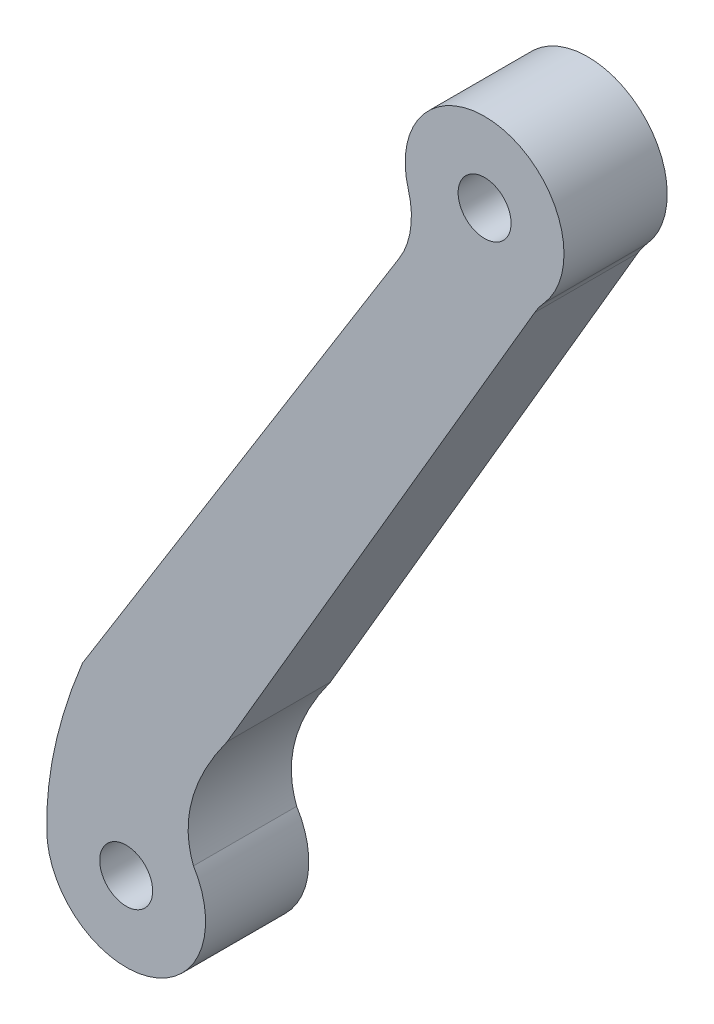
ISO-10303-21;
HEADER;
FILE_DESCRIPTION(('STEP AP214'),'2;1');
FILE_NAME('part.step','',(''),(''),'','','');
FILE_SCHEMA(('AUTOMOTIVE_DESIGN { 1 0 10303 214 1 1 1 1 }'));
ENDSEC;
DATA;
#1=APPLICATION_CONTEXT('core data for automotive mechanical design processes');
#2=APPLICATION_PROTOCOL_DEFINITION('international standard','automotive_design',2000,#1);
#3=PRODUCT_CONTEXT('',#1,'mechanical');
#4=PRODUCT('Part','Part','',(#3));
#5=PRODUCT_RELATED_PRODUCT_CATEGORY('part','',(#4));
#6=PRODUCT_DEFINITION_FORMATION('','',#4);
#7=PRODUCT_DEFINITION_CONTEXT('part definition',#1,'design');
#8=PRODUCT_DEFINITION('design','',#6,#7);
#9=PRODUCT_DEFINITION_SHAPE('','',#8);
#10=(LENGTH_UNIT() NAMED_UNIT(*) SI_UNIT(.MILLI.,.METRE.));
#11=(NAMED_UNIT(*) PLANE_ANGLE_UNIT() SI_UNIT($,.RADIAN.));
#12=(NAMED_UNIT(*) SI_UNIT($,.STERADIAN.) SOLID_ANGLE_UNIT());
#13=UNCERTAINTY_MEASURE_WITH_UNIT(LENGTH_MEASURE(1.E-05),#10,'distance_accuracy_value','');
#14=(GEOMETRIC_REPRESENTATION_CONTEXT(3) GLOBAL_UNCERTAINTY_ASSIGNED_CONTEXT((#13)) GLOBAL_UNIT_ASSIGNED_CONTEXT((#10,
#11,#12)) REPRESENTATION_CONTEXT('',''));
#15=CARTESIAN_POINT('',(0.,0.,0.));
#16=DIRECTION('',(0.,0.,1.));
#17=DIRECTION('',(1.,0.,0.));
#18=AXIS2_PLACEMENT_3D('',#15,#16,#17);
#19=CARTESIAN_POINT('',(18.0164608532114,94.1948252806854,3.9));
#20=CARTESIAN_POINT('',(15.9886170182341,91.4157600232767,3.9));
#21=CARTESIAN_POINT('',(16.7389516223177,89.4869260874124,3.9));
#22=B_SPLINE_CURVE_WITH_KNOTS('',2,(#19,#20,#21),.UNSPECIFIED.,.F.,.F.,(3,3),(0.,1.),.UNSPECIFIED.);
#23=DIRECTION('',(0.,0.,-1.));
#24=VECTOR('',#23,1.);
#25=SURFACE_OF_LINEAR_EXTRUSION('',#22,#24);
#26=CARTESIAN_POINT('',(18.0164608532114,94.1948252806854,0.));
#27=CARTESIAN_POINT('',(15.9886170182341,91.4157600232767,0.));
#28=CARTESIAN_POINT('',(16.7389516223177,89.4869260874124,0.));
#29=B_SPLINE_CURVE_WITH_KNOTS('',2,(#26,#27,#28),.UNSPECIFIED.,.F.,.F.,(3,3),(0.,1.),.UNSPECIFIED.);
#30=CARTESIAN_POINT('',(18.0164608532114,94.1948252806854,0.));
#31=VERTEX_POINT('',#30);
#32=CARTESIAN_POINT('',(16.7389516223177,89.4869260874124,0.));
#33=VERTEX_POINT('',#32);
#34=EDGE_CURVE('E172',#31,#33,#29,.T.);
#35=ORIENTED_EDGE('',*,*,#34,.F.);
#36=DIRECTION('',(0.,0.,-1.));
#37=VECTOR('',#36,1.);
#38=CARTESIAN_POINT('',(18.0164608532114,94.1948252806854,3.9));
#39=LINE('',#38,#37);
#40=CARTESIAN_POINT('',(18.0164608532114,94.1948252806854,3.9));
#41=VERTEX_POINT('',#40);
#42=EDGE_CURVE('E11',#41,#31,#39,.T.);
#43=ORIENTED_EDGE('',*,*,#42,.F.);
#44=CARTESIAN_POINT('',(16.7389516223177,89.4869260874124,3.9));
#45=VERTEX_POINT('',#44);
#46=EDGE_CURVE('E202',#41,#45,#22,.T.);
#47=ORIENTED_EDGE('',*,*,#46,.T.);
#48=DIRECTION('',(0.,0.,-1.));
#49=VECTOR('',#48,1.);
#50=CARTESIAN_POINT('',(16.7389516223177,89.4869260874124,3.9));
#51=LINE('',#50,#49);
#52=EDGE_CURVE('E87',#45,#33,#51,.T.);
#53=ORIENTED_EDGE('',*,*,#52,.T.);
#54=EDGE_LOOP('',(#35,#43,#47,#53));
#55=FACE_BOUND('',#54,.T.);
#56=ADVANCED_FACE('F36',(#55),#25,.T.);
#57=CARTESIAN_POINT('',(-27.64151576103,16.1763745397966,3.9));
#58=DIRECTION('',(0.863069254822421,-0.505085598072515,0.));
#59=DIRECTION('',(0.505085598072515,0.863069254822421,0.));
#60=AXIS2_PLACEMENT_3D('',#57,#58,#59);
#61=PLANE('',#60);
#62=DIRECTION('',(-0.505085598072515,-0.863069254822422,0.));
#63=VECTOR('',#62,1.);
#64=CARTESIAN_POINT('',(-27.64151576103,16.1763745397966,0.));
#65=LINE('',#64,#63);
#66=CARTESIAN_POINT('',(29.6287438279882,114.037411274176,0.));
#67=VERTEX_POINT('',#66);
#68=EDGE_CURVE('E165',#67,#31,#65,.T.);
#69=ORIENTED_EDGE('',*,*,#68,.F.);
#70=DIRECTION('',(0.,0.,-1.));
#71=VECTOR('',#70,1.);
#72=CARTESIAN_POINT('',(29.6287438279882,114.037411274176,3.9));
#73=LINE('',#72,#71);
#74=CARTESIAN_POINT('',(29.6287438279882,114.037411274176,3.9));
#75=VERTEX_POINT('',#74);
#76=EDGE_CURVE('E45',#75,#67,#73,.T.);
#77=ORIENTED_EDGE('',*,*,#76,.F.);
#78=DIRECTION('',(-0.505085598072515,-0.863069254822422,0.));
#79=VECTOR('',#78,1.);
#80=CARTESIAN_POINT('',(-27.64151576103,16.1763745397966,3.9));
#81=LINE('',#80,#79);
#82=EDGE_CURVE('E214',#75,#41,#81,.T.);
#83=ORIENTED_EDGE('',*,*,#82,.T.);
#84=ORIENTED_EDGE('',*,*,#42,.T.);
#85=EDGE_LOOP('',(#69,#77,#83,#84));
#86=FACE_BOUND('',#85,.T.);
#87=ADVANCED_FACE('F156',(#86),#61,.T.);
#88=CARTESIAN_POINT('',(32.2179515924554,112.522154479959,3.9));
#89=DIRECTION('',(0.,0.,-1.));
#90=DIRECTION('',(-1.,0.,0.));
#91=AXIS2_PLACEMENT_3D('',#88,#89,#90);
#92=CYLINDRICAL_SURFACE('',#91,3.00000000000001);
#93=CARTESIAN_POINT('',(32.2179515924554,112.522154479959,0.));
#94=DIRECTION('',(0.,0.,1.));
#95=DIRECTION('',(1.,0.,0.));
#96=AXIS2_PLACEMENT_3D('',#93,#94,#95);
#97=CIRCLE('',#96,3.00000000000001);
#98=CARTESIAN_POINT('',(29.977739071708,114.517511055082,0.));
#99=VERTEX_POINT('',#98);
#100=EDGE_CURVE('E171',#99,#67,#97,.T.);
#101=ORIENTED_EDGE('',*,*,#100,.F.);
#102=DIRECTION('',(0.,0.,-1.));
#103=VECTOR('',#102,1.);
#104=CARTESIAN_POINT('',(29.977739071708,114.517511055082,3.9));
#105=LINE('',#104,#103);
#106=CARTESIAN_POINT('',(29.977739071708,114.517511055082,3.9));
#107=VERTEX_POINT('',#106);
#108=EDGE_CURVE('E209',#107,#99,#105,.T.);
#109=ORIENTED_EDGE('',*,*,#108,.F.);
#110=CARTESIAN_POINT('',(32.2179515924554,112.522154479959,3.9));
#111=DIRECTION('',(0.,0.,1.));
#112=DIRECTION('',(1.,0.,0.));
#113=AXIS2_PLACEMENT_3D('',#110,#111,#112);
#114=CIRCLE('',#113,3.00000000000001);
#115=EDGE_CURVE('E212',#107,#75,#114,.T.);
#116=ORIENTED_EDGE('',*,*,#115,.T.);
#117=ORIENTED_EDGE('',*,*,#76,.T.);
#118=EDGE_LOOP('',(#101,#109,#116,#117));
#119=FACE_BOUND('',#118,.T.);
#120=ADVANCED_FACE('F153',(#119),#92,.F.);
#121=CARTESIAN_POINT('',(27.7375265509606,116.512867630205,3.9));
#122=DIRECTION('',(0.,0.,-1.));
#123=DIRECTION('',(-1.,0.,0.));
#124=AXIS2_PLACEMENT_3D('',#121,#122,#123);
#125=CYLINDRICAL_SURFACE('',#124,3.);
#126=CARTESIAN_POINT('',(27.7375265509606,116.512867630205,0.));
#127=DIRECTION('',(0.,0.,1.));
#128=DIRECTION('',(1.,0.,0.));
#129=AXIS2_PLACEMENT_3D('',#126,#127,#128);
#130=CIRCLE('',#129,3.);
#131=CARTESIAN_POINT('',(24.854741228717,115.682476887327,0.));
#132=VERTEX_POINT('',#131);
#133=EDGE_CURVE('E180',#99,#132,#130,.T.);
#134=ORIENTED_EDGE('',*,*,#133,.T.);
#135=DIRECTION('',(0.,0.,-1.));
#136=VECTOR('',#135,1.);
#137=CARTESIAN_POINT('',(24.854741228717,115.682476887327,3.9));
#138=LINE('',#137,#136);
#139=CARTESIAN_POINT('',(24.854741228717,115.682476887327,3.9));
#140=VERTEX_POINT('',#139);
#141=EDGE_CURVE('E207',#140,#132,#138,.T.);
#142=ORIENTED_EDGE('',*,*,#141,.F.);
#143=CARTESIAN_POINT('',(27.7375265509606,116.512867630205,3.9));
#144=DIRECTION('',(0.,0.,1.));
#145=DIRECTION('',(1.,0.,0.));
#146=AXIS2_PLACEMENT_3D('',#143,#144,#145);
#147=CIRCLE('',#146,3.);
#148=EDGE_CURVE('E126',#107,#140,#147,.T.);
#149=ORIENTED_EDGE('',*,*,#148,.F.);
#150=ORIENTED_EDGE('',*,*,#108,.T.);
#151=EDGE_LOOP('',(#134,#142,#149,#150));
#152=FACE_BOUND('',#151,.T.);
#153=ADVANCED_FACE('F149',(#152),#125,.T.);
#154=CARTESIAN_POINT('',(21.9719559064734,114.85208614445,3.9));
#155=DIRECTION('',(0.,0.,-1.));
#156=DIRECTION('',(-1.,0.,0.));
#157=AXIS2_PLACEMENT_3D('',#154,#155,#156);
#158=CYLINDRICAL_SURFACE('',#157,3.);
#159=CARTESIAN_POINT('',(21.9719559064734,114.85208614445,0.));
#160=DIRECTION('',(0.,0.,1.));
#161=DIRECTION('',(1.,0.,0.));
#162=AXIS2_PLACEMENT_3D('',#159,#160,#161);
#163=CIRCLE('',#162,3.);
#164=CARTESIAN_POINT('',(24.5189597292417,113.266913747893,0.));
#165=VERTEX_POINT('',#164);
#166=EDGE_CURVE('E182',#165,#132,#163,.T.);
#167=ORIENTED_EDGE('',*,*,#166,.F.);
#168=DIRECTION('',(0.,0.,-1.));
#169=VECTOR('',#168,1.);
#170=CARTESIAN_POINT('',(24.5189597292417,113.266913747893,3.9));
#171=LINE('',#170,#169);
#172=CARTESIAN_POINT('',(24.5189597292417,113.266913747893,3.9));
#173=VERTEX_POINT('',#172);
#174=EDGE_CURVE('E114',#173,#165,#171,.T.);
#175=ORIENTED_EDGE('',*,*,#174,.F.);
#176=CARTESIAN_POINT('',(21.9719559064734,114.85208614445,3.9));
#177=DIRECTION('',(0.,0.,1.));
#178=DIRECTION('',(1.,0.,0.));
#179=AXIS2_PLACEMENT_3D('',#176,#177,#178);
#180=CIRCLE('',#179,3.);
#181=EDGE_CURVE('E124',#173,#140,#180,.T.);
#182=ORIENTED_EDGE('',*,*,#181,.T.);
#183=ORIENTED_EDGE('',*,*,#141,.T.);
#184=EDGE_LOOP('',(#167,#175,#182,#183));
#185=FACE_BOUND('',#184,.T.);
#186=ADVANCED_FACE('F146',(#185),#158,.F.);
#187=CARTESIAN_POINT('',(-33.1386991079217,20.6244492505586,3.9));
#188=DIRECTION('',(-0.849001274256077,0.528390798852098,0.));
#189=DIRECTION('',(-0.528390798852098,-0.849001274256077,0.));
#190=AXIS2_PLACEMENT_3D('',#187,#188,#189);
#191=PLANE('',#190);
#192=DIRECTION('',(0.528390798852098,0.849001274256077,0.));
#193=VECTOR('',#192,1.);
#194=CARTESIAN_POINT('',(-33.1386991079217,20.6244492505586,0.));
#195=LINE('',#194,#193);
#196=CARTESIAN_POINT('',(12.5460152334742,94.0291731294213,0.));
#197=VERTEX_POINT('',#196);
#198=EDGE_CURVE('E113',#197,#165,#195,.T.);
#199=ORIENTED_EDGE('',*,*,#198,.F.);
#200=DIRECTION('',(0.,0.,-1.));
#201=VECTOR('',#200,1.);
#202=CARTESIAN_POINT('',(12.5460152334742,94.0291731294213,3.9));
#203=LINE('',#202,#201);
#204=CARTESIAN_POINT('',(12.5460152334742,94.0291731294213,3.9));
#205=VERTEX_POINT('',#204);
#206=EDGE_CURVE('E107',#205,#197,#203,.T.);
#207=ORIENTED_EDGE('',*,*,#206,.F.);
#208=DIRECTION('',(0.528390798852098,0.849001274256077,0.));
#209=VECTOR('',#208,1.);
#210=CARTESIAN_POINT('',(-33.1386991079217,20.6244492505586,3.9));
#211=LINE('',#210,#209);
#212=EDGE_CURVE('E111',#205,#173,#211,.T.);
#213=ORIENTED_EDGE('',*,*,#212,.T.);
#214=ORIENTED_EDGE('',*,*,#174,.T.);
#215=EDGE_LOOP('',(#199,#207,#213,#214));
#216=FACE_BOUND('',#215,.T.);
#217=ADVANCED_FACE('F109',(#216),#191,.T.);
#218=CARTESIAN_POINT('',(12.5460152334742,94.0291731294213,3.9));
#219=CARTESIAN_POINT('',(11.1432009751376,90.6207808117427,3.9));
#220=CARTESIAN_POINT('',(11.1958575437404,87.8954888415541,3.9));
#221=B_SPLINE_CURVE_WITH_KNOTS('',2,(#218,#219,#220),.UNSPECIFIED.,.F.,.F.,(3,3),(0.,1.),.UNSPECIFIED.);
#222=DIRECTION('',(0.,0.,-1.));
#223=VECTOR('',#222,1.);
#224=SURFACE_OF_LINEAR_EXTRUSION('',#221,#223);
#225=CARTESIAN_POINT('',(12.5460152334742,94.0291731294213,0.));
#226=CARTESIAN_POINT('',(11.1432009751376,90.6207808117427,0.));
#227=CARTESIAN_POINT('',(11.1958575437404,87.8954888415541,0.));
#228=B_SPLINE_CURVE_WITH_KNOTS('',2,(#225,#226,#227),.UNSPECIFIED.,.F.,.F.,(3,3),(0.,1.),.UNSPECIFIED.);
#229=CARTESIAN_POINT('',(11.1958575437404,87.8954888415541,0.));
#230=VERTEX_POINT('',#229);
#231=EDGE_CURVE('E80',#197,#230,#228,.T.);
#232=ORIENTED_EDGE('',*,*,#231,.T.);
#233=DIRECTION('',(0.,0.,-1.));
#234=VECTOR('',#233,1.);
#235=CARTESIAN_POINT('',(11.1958575437404,87.8954888415541,3.9));
#236=LINE('',#235,#234);
#237=CARTESIAN_POINT('',(11.1958575437404,87.8954888415541,3.9));
#238=VERTEX_POINT('',#237);
#239=EDGE_CURVE('E115',#238,#230,#236,.T.);
#240=ORIENTED_EDGE('',*,*,#239,.F.);
#241=EDGE_CURVE('E117',#205,#238,#221,.T.);
#242=ORIENTED_EDGE('',*,*,#241,.F.);
#243=ORIENTED_EDGE('',*,*,#206,.T.);
#244=EDGE_LOOP('',(#232,#240,#242,#243));
#245=FACE_BOUND('',#244,.T.);
#246=ADVANCED_FACE('F118',(#245),#224,.F.);
#247=CARTESIAN_POINT('',(27.7375265509606,116.512867630205,3.9));
#248=DIRECTION('',(0.,0.,-1.));
#249=DIRECTION('',(-1.,0.,0.));
#250=AXIS2_PLACEMENT_3D('',#247,#248,#249);
#251=CYLINDRICAL_SURFACE('',#250,1.);
#252=CARTESIAN_POINT('',(27.7375265509606,116.512867630205,3.9));
#253=DIRECTION('',(0.,0.,1.));
#254=DIRECTION('',(1.,0.,0.));
#255=AXIS2_PLACEMENT_3D('',#252,#253,#254);
#256=CIRCLE('',#255,1.);
#257=CARTESIAN_POINT('',(28.7375265509606,116.512867630205,3.9));
#258=VERTEX_POINT('',#257);
#259=EDGE_CURVE('E231',#258,#258,#256,.T.);
#260=ORIENTED_EDGE('',*,*,#259,.T.);
#261=EDGE_LOOP('',(#260));
#262=FACE_BOUND('',#261,.T.);
#263=CARTESIAN_POINT('',(27.7375265509606,116.512867630205,0.));
#264=DIRECTION('',(0.,0.,1.));
#265=DIRECTION('',(1.,0.,0.));
#266=AXIS2_PLACEMENT_3D('',#263,#264,#265);
#267=CIRCLE('',#266,1.);
#268=CARTESIAN_POINT('',(28.7375265509606,116.512867630205,0.));
#269=VERTEX_POINT('',#268);
#270=EDGE_CURVE('E196',#269,#269,#267,.T.);
#271=ORIENTED_EDGE('',*,*,#270,.F.);
#272=EDGE_LOOP('',(#271));
#273=FACE_BOUND('',#272,.T.);
#274=ADVANCED_FACE('F141',(#262,#273),#251,.F.);
#275=CARTESIAN_POINT('',(14.1958575437404,87.8954888415541,3.9));
#276=DIRECTION('',(0.,0.,-1.));
#277=DIRECTION('',(-1.,0.,0.));
#278=AXIS2_PLACEMENT_3D('',#275,#276,#277);
#279=CYLINDRICAL_SURFACE('',#278,3.);
#280=CARTESIAN_POINT('',(14.1958575437404,87.8954888415541,0.));
#281=DIRECTION('',(0.,0.,1.));
#282=DIRECTION('',(1.,0.,0.));
#283=AXIS2_PLACEMENT_3D('',#280,#281,#282);
#284=CIRCLE('',#283,3.);
#285=EDGE_CURVE('E191',#230,#33,#284,.T.);
#286=ORIENTED_EDGE('',*,*,#285,.T.);
#287=ORIENTED_EDGE('',*,*,#52,.F.);
#288=CARTESIAN_POINT('',(14.1958575437404,87.8954888415541,3.9));
#289=DIRECTION('',(0.,0.,1.));
#290=DIRECTION('',(1.,0.,0.));
#291=AXIS2_PLACEMENT_3D('',#288,#289,#290);
#292=CIRCLE('',#291,3.);
#293=EDGE_CURVE('E53',#238,#45,#292,.T.);
#294=ORIENTED_EDGE('',*,*,#293,.F.);
#295=ORIENTED_EDGE('',*,*,#239,.T.);
#296=EDGE_LOOP('',(#286,#287,#294,#295));
#297=FACE_BOUND('',#296,.T.);
#298=ADVANCED_FACE('F142',(#297),#279,.T.);
#299=CARTESIAN_POINT('',(14.1958575437404,87.8954888415541,3.9));
#300=DIRECTION('',(0.,0.,-1.));
#301=DIRECTION('',(-1.,0.,0.));
#302=AXIS2_PLACEMENT_3D('',#299,#300,#301);
#303=CYLINDRICAL_SURFACE('',#302,1.);
#304=CARTESIAN_POINT('',(14.1958575437404,87.8954888415541,3.9));
#305=DIRECTION('',(0.,0.,1.));
#306=DIRECTION('',(1.,0.,0.));
#307=AXIS2_PLACEMENT_3D('',#304,#305,#306);
#308=CIRCLE('',#307,1.);
#309=CARTESIAN_POINT('',(15.1958575437404,87.8954888415541,3.9));
#310=VERTEX_POINT('',#309);
#311=EDGE_CURVE('E204',#310,#310,#308,.T.);
#312=ORIENTED_EDGE('',*,*,#311,.T.);
#313=EDGE_LOOP('',(#312));
#314=FACE_BOUND('',#313,.T.);
#315=CARTESIAN_POINT('',(14.1958575437404,87.8954888415541,0.));
#316=DIRECTION('',(0.,0.,1.));
#317=DIRECTION('',(1.,0.,0.));
#318=AXIS2_PLACEMENT_3D('',#315,#316,#317);
#319=CIRCLE('',#318,1.);
#320=CARTESIAN_POINT('',(15.1958575437404,87.8954888415541,0.));
#321=VERTEX_POINT('',#320);
#322=EDGE_CURVE('E199',#321,#321,#319,.T.);
#323=ORIENTED_EDGE('',*,*,#322,.F.);
#324=EDGE_LOOP('',(#323));
#325=FACE_BOUND('',#324,.T.);
#326=ADVANCED_FACE('F238',(#314,#325),#303,.F.);
#327=CARTESIAN_POINT('',(0.,0.,3.9));
#328=DIRECTION('',(0.,0.,1.));
#329=DIRECTION('',(1.,0.,0.));
#330=AXIS2_PLACEMENT_3D('',#327,#328,#329);
#331=PLANE('',#330);
#332=ORIENTED_EDGE('',*,*,#46,.F.);
#333=ORIENTED_EDGE('',*,*,#82,.F.);
#334=ORIENTED_EDGE('',*,*,#115,.F.);
#335=ORIENTED_EDGE('',*,*,#148,.T.);
#336=ORIENTED_EDGE('',*,*,#181,.F.);
#337=ORIENTED_EDGE('',*,*,#212,.F.);
#338=ORIENTED_EDGE('',*,*,#241,.T.);
#339=ORIENTED_EDGE('',*,*,#293,.T.);
#340=EDGE_LOOP('',(#332,#333,#334,#335,#336,#337,#338,#339));
#341=FACE_BOUND('',#340,.T.);
#342=ORIENTED_EDGE('',*,*,#259,.F.);
#343=EDGE_LOOP('',(#342));
#344=FACE_BOUND('',#343,.T.);
#345=ORIENTED_EDGE('',*,*,#311,.F.);
#346=EDGE_LOOP('',(#345));
#347=FACE_BOUND('',#346,.T.);
#348=ADVANCED_FACE('F121',(#341,#344,#347),#331,.T.);
#349=CARTESIAN_POINT('',(0.,0.,0.));
#350=DIRECTION('',(0.,0.,1.));
#351=DIRECTION('',(1.,0.,0.));
#352=AXIS2_PLACEMENT_3D('',#349,#350,#351);
#353=PLANE('',#352);
#354=ORIENTED_EDGE('',*,*,#34,.T.);
#355=ORIENTED_EDGE('',*,*,#285,.F.);
#356=ORIENTED_EDGE('',*,*,#231,.F.);
#357=ORIENTED_EDGE('',*,*,#198,.T.);
#358=ORIENTED_EDGE('',*,*,#166,.T.);
#359=ORIENTED_EDGE('',*,*,#133,.F.);
#360=ORIENTED_EDGE('',*,*,#100,.T.);
#361=ORIENTED_EDGE('',*,*,#68,.T.);
#362=EDGE_LOOP('',(#354,#355,#356,#357,#358,#359,#360,#361));
#363=FACE_BOUND('',#362,.T.);
#364=ORIENTED_EDGE('',*,*,#270,.T.);
#365=EDGE_LOOP('',(#364));
#366=FACE_BOUND('',#365,.T.);
#367=ORIENTED_EDGE('',*,*,#322,.T.);
#368=EDGE_LOOP('',(#367));
#369=FACE_BOUND('',#368,.T.);
#370=ADVANCED_FACE('F176',(#363,#366,#369),#353,.F.);
#371=CLOSED_SHELL('',(#56,#87,#120,#153,#186,#217,#246,#274,#298,#326,#348,#370));
#372=MANIFOLD_SOLID_BREP('B2',#371);
#373=ADVANCED_BREP_SHAPE_REPRESENTATION('',(#18,#372),#14);
#374=SHAPE_DEFINITION_REPRESENTATION(#9,#373);
ENDSEC;
END-ISO-10303-21;
